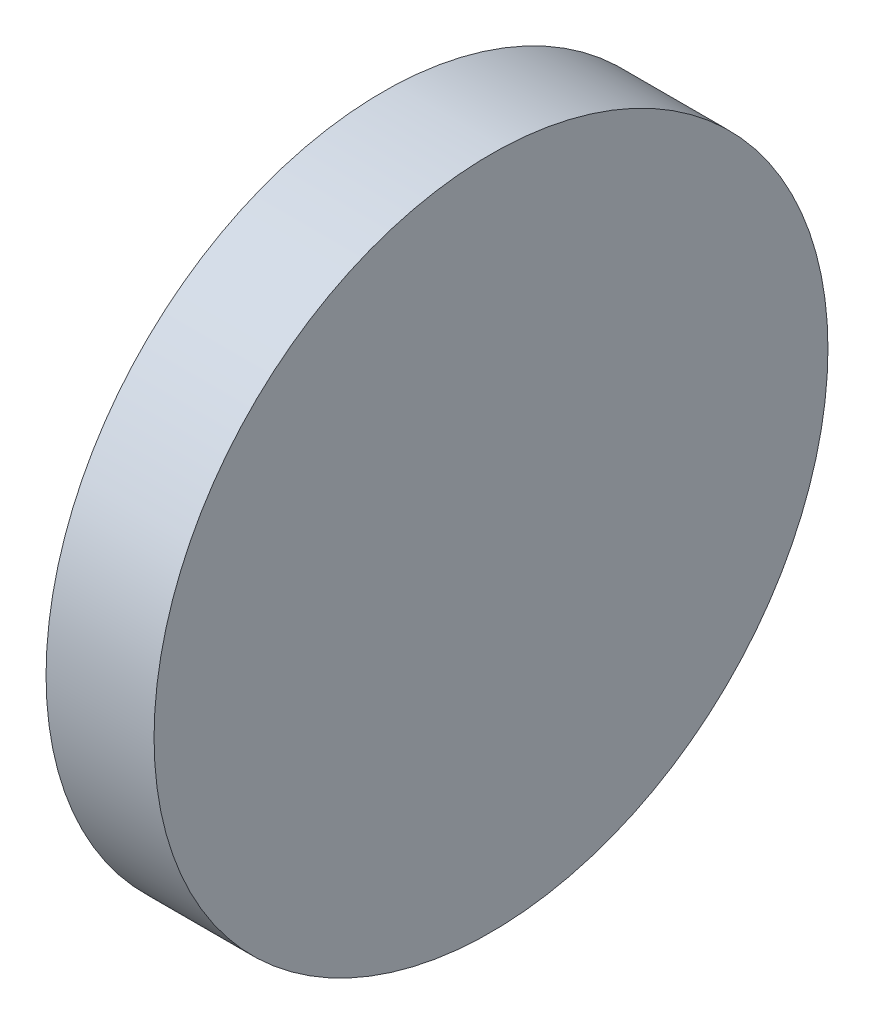
ISO-10303-21;
HEADER;
FILE_DESCRIPTION(('STEP AP214'),'2;1');
FILE_NAME('part.step','',(''),(''),'','','');
FILE_SCHEMA(('AUTOMOTIVE_DESIGN { 1 0 10303 214 1 1 1 1 }'));
ENDSEC;
DATA;
#1=APPLICATION_CONTEXT('core data for automotive mechanical design processes');
#2=APPLICATION_PROTOCOL_DEFINITION('international standard','automotive_design',2000,#1);
#3=PRODUCT_CONTEXT('',#1,'mechanical');
#4=PRODUCT('Part','Part','',(#3));
#5=PRODUCT_RELATED_PRODUCT_CATEGORY('part','',(#4));
#6=PRODUCT_DEFINITION_FORMATION('','',#4);
#7=PRODUCT_DEFINITION_CONTEXT('part definition',#1,'design');
#8=PRODUCT_DEFINITION('design','',#6,#7);
#9=PRODUCT_DEFINITION_SHAPE('','',#8);
#10=(LENGTH_UNIT() NAMED_UNIT(*) SI_UNIT(.MILLI.,.METRE.));
#11=(NAMED_UNIT(*) PLANE_ANGLE_UNIT() SI_UNIT($,.RADIAN.));
#12=(NAMED_UNIT(*) SI_UNIT($,.STERADIAN.) SOLID_ANGLE_UNIT());
#13=UNCERTAINTY_MEASURE_WITH_UNIT(LENGTH_MEASURE(1.E-05),#10,'distance_accuracy_value','');
#14=(GEOMETRIC_REPRESENTATION_CONTEXT(3) GLOBAL_UNCERTAINTY_ASSIGNED_CONTEXT((#13)) GLOBAL_UNIT_ASSIGNED_CONTEXT((#10,
#11,#12)) REPRESENTATION_CONTEXT('',''));
#15=CARTESIAN_POINT('',(0.,0.,0.));
#16=DIRECTION('',(0.,0.,1.));
#17=DIRECTION('',(1.,0.,0.));
#18=AXIS2_PLACEMENT_3D('',#15,#16,#17);
#19=CARTESIAN_POINT('',(10.68000226,-0.0002057399999984,3.25000112));
#20=DIRECTION('',(1.,0.,0.));
#21=DIRECTION('',(0.,0.,-1.));
#22=AXIS2_PLACEMENT_3D('',#19,#20,#21);
#23=PLANE('',#22);
#24=CARTESIAN_POINT('',(10.68000226,-0.0002057399999984,3.25000112));
#25=DIRECTION('',(1.,0.,0.));
#26=DIRECTION('',(0.,0.,-1.));
#27=AXIS2_PLACEMENT_3D('',#24,#25,#26);
#28=CIRCLE('',#27,3.119999885559);
#29=CARTESIAN_POINT('',(10.68000226,-0.0002057399999984,0.130001234441));
#30=VERTEX_POINT('',#29);
#31=EDGE_CURVE('E18',#30,#30,#28,.T.);
#32=ORIENTED_EDGE('',*,*,#31,.F.);
#33=EDGE_LOOP('',(#32));
#34=FACE_BOUND('',#33,.T.);
#35=ADVANCED_FACE('F15',(#34),#23,.F.);
#36=CARTESIAN_POINT('',(10.68000226,-0.0002057399999984,3.25000112));
#37=DIRECTION('',(1.,0.,0.));
#38=DIRECTION('',(0.,0.,-1.));
#39=AXIS2_PLACEMENT_3D('',#36,#37,#38);
#40=CYLINDRICAL_SURFACE('',#39,3.119999885559);
#41=ORIENTED_EDGE('',*,*,#31,.T.);
#42=EDGE_LOOP('',(#41));
#43=FACE_BOUND('',#42,.T.);
#44=CARTESIAN_POINT('',(11.68000226,-0.0002057399999984,3.25000112));
#45=DIRECTION('',(1.,0.,0.));
#46=DIRECTION('',(0.,0.,-1.));
#47=AXIS2_PLACEMENT_3D('',#44,#45,#46);
#48=CIRCLE('',#47,3.119999885559);
#49=CARTESIAN_POINT('',(11.68000226,-0.0002057399999984,0.130001234441));
#50=VERTEX_POINT('',#49);
#51=EDGE_CURVE('E10',#50,#50,#48,.T.);
#52=ORIENTED_EDGE('',*,*,#51,.F.);
#53=EDGE_LOOP('',(#52));
#54=FACE_BOUND('',#53,.T.);
#55=ADVANCED_FACE('F27',(#43,#54),#40,.T.);
#56=CARTESIAN_POINT('',(11.68000226,-0.0002057399999984,3.25000112));
#57=DIRECTION('',(1.,0.,0.));
#58=DIRECTION('',(0.,0.,-1.));
#59=AXIS2_PLACEMENT_3D('',#56,#57,#58);
#60=PLANE('',#59);
#61=ORIENTED_EDGE('',*,*,#51,.T.);
#62=EDGE_LOOP('',(#61));
#63=FACE_BOUND('',#62,.T.);
#64=ADVANCED_FACE('F35',(#63),#60,.T.);
#65=CLOSED_SHELL('',(#35,#55,#64));
#66=MANIFOLD_SOLID_BREP('B1',#65);
#67=ADVANCED_BREP_SHAPE_REPRESENTATION('',(#18,#66),#14);
#68=SHAPE_DEFINITION_REPRESENTATION(#9,#67);
ENDSEC;
END-ISO-10303-21;
